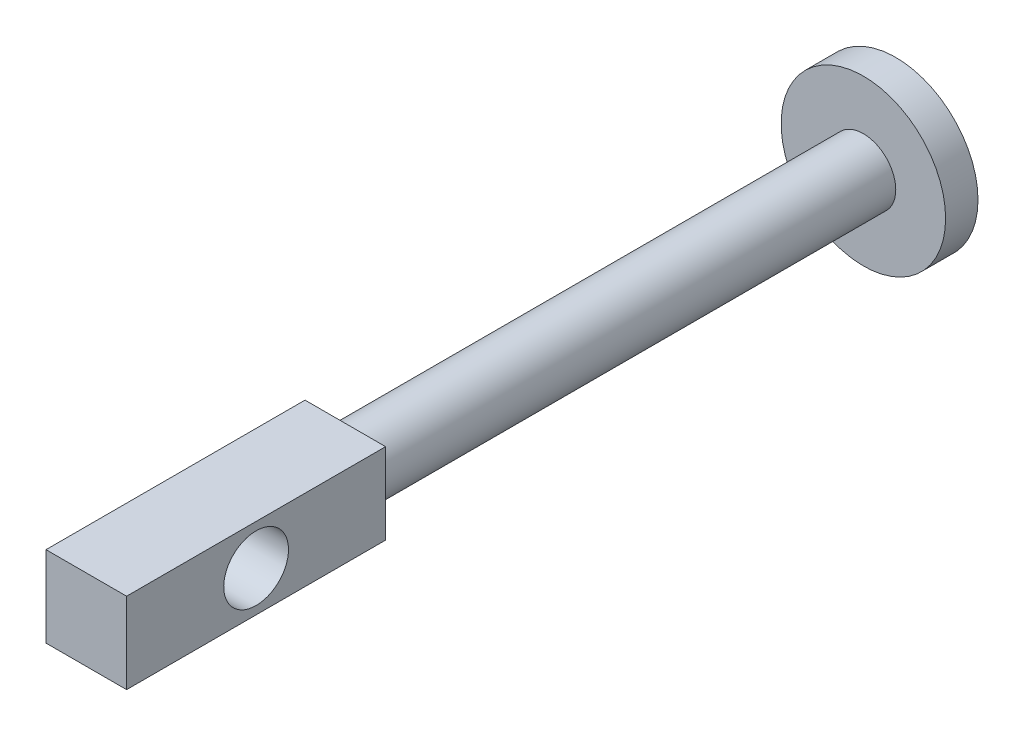
ISO-10303-21;
HEADER;
FILE_DESCRIPTION(('STEP AP214'),'2;1');
FILE_NAME('part.step','',(''),(''),'','','');
FILE_SCHEMA(('AUTOMOTIVE_DESIGN { 1 0 10303 214 1 1 1 1 }'));
ENDSEC;
DATA;
#1=APPLICATION_CONTEXT('core data for automotive mechanical design processes');
#2=APPLICATION_PROTOCOL_DEFINITION('international standard','automotive_design',2000,#1);
#3=PRODUCT_CONTEXT('',#1,'mechanical');
#4=PRODUCT('Part','Part','',(#3));
#5=PRODUCT_RELATED_PRODUCT_CATEGORY('part','',(#4));
#6=PRODUCT_DEFINITION_FORMATION('','',#4);
#7=PRODUCT_DEFINITION_CONTEXT('part definition',#1,'design');
#8=PRODUCT_DEFINITION('design','',#6,#7);
#9=PRODUCT_DEFINITION_SHAPE('','',#8);
#10=(LENGTH_UNIT() NAMED_UNIT(*) SI_UNIT(.MILLI.,.METRE.));
#11=(NAMED_UNIT(*) PLANE_ANGLE_UNIT() SI_UNIT($,.RADIAN.));
#12=(NAMED_UNIT(*) SI_UNIT($,.STERADIAN.) SOLID_ANGLE_UNIT());
#13=UNCERTAINTY_MEASURE_WITH_UNIT(LENGTH_MEASURE(1.E-05),#10,'distance_accuracy_value','');
#14=(GEOMETRIC_REPRESENTATION_CONTEXT(3) GLOBAL_UNCERTAINTY_ASSIGNED_CONTEXT((#13)) GLOBAL_UNIT_ASSIGNED_CONTEXT((#10,
#11,#12)) REPRESENTATION_CONTEXT('',''));
#15=CARTESIAN_POINT('',(0.,0.,0.));
#16=DIRECTION('',(0.,0.,1.));
#17=DIRECTION('',(1.,0.,0.));
#18=AXIS2_PLACEMENT_3D('',#15,#16,#17);
#19=CARTESIAN_POINT('',(0.,0.,5.));
#20=DIRECTION('',(0.,0.,1.));
#21=DIRECTION('',(1.,0.,0.));
#22=AXIS2_PLACEMENT_3D('',#19,#20,#21);
#23=PLANE('',#22);
#24=CARTESIAN_POINT('',(0.,0.,5.));
#25=DIRECTION('',(0.,0.,1.));
#26=DIRECTION('',(1.,0.,0.));
#27=AXIS2_PLACEMENT_3D('',#24,#25,#26);
#28=CIRCLE('',#27,12.7);
#29=CARTESIAN_POINT('',(12.7,0.,5.));
#30=VERTEX_POINT('',#29);
#31=EDGE_CURVE('E11',#30,#30,#28,.T.);
#32=ORIENTED_EDGE('',*,*,#31,.T.);
#33=EDGE_LOOP('',(#32));
#34=FACE_BOUND('',#33,.T.);
#35=CARTESIAN_POINT('',(0.,0.,5.));
#36=DIRECTION('',(0.,0.,1.));
#37=DIRECTION('',(1.,0.,0.));
#38=AXIS2_PLACEMENT_3D('',#35,#36,#37);
#39=CIRCLE('',#38,5.);
#40=CARTESIAN_POINT('',(5.,0.,5.));
#41=VERTEX_POINT('',#40);
#42=EDGE_CURVE('E130',#41,#41,#39,.T.);
#43=ORIENTED_EDGE('',*,*,#42,.F.);
#44=EDGE_LOOP('',(#43));
#45=FACE_BOUND('',#44,.T.);
#46=ADVANCED_FACE('F39',(#34,#45),#23,.T.);
#47=CARTESIAN_POINT('',(0.,0.,5.));
#48=DIRECTION('',(0.,0.,-1.));
#49=DIRECTION('',(-1.,0.,0.));
#50=AXIS2_PLACEMENT_3D('',#47,#48,#49);
#51=CYLINDRICAL_SURFACE('',#50,12.7);
#52=ORIENTED_EDGE('',*,*,#31,.F.);
#53=EDGE_LOOP('',(#52));
#54=FACE_BOUND('',#53,.T.);
#55=CARTESIAN_POINT('',(0.,0.,0.));
#56=DIRECTION('',(0.,0.,1.));
#57=DIRECTION('',(1.,0.,0.));
#58=AXIS2_PLACEMENT_3D('',#55,#56,#57);
#59=CIRCLE('',#58,12.7);
#60=CARTESIAN_POINT('',(12.7,0.,0.));
#61=VERTEX_POINT('',#60);
#62=EDGE_CURVE('E50',#61,#61,#59,.T.);
#63=ORIENTED_EDGE('',*,*,#62,.T.);
#64=EDGE_LOOP('',(#63));
#65=FACE_BOUND('',#64,.T.);
#66=ADVANCED_FACE('F41',(#54,#65),#51,.T.);
#67=CARTESIAN_POINT('',(0.,0.,0.));
#68=DIRECTION('',(0.,0.,1.));
#69=DIRECTION('',(1.,0.,0.));
#70=AXIS2_PLACEMENT_3D('',#67,#68,#69);
#71=PLANE('',#70);
#72=ORIENTED_EDGE('',*,*,#62,.F.);
#73=EDGE_LOOP('',(#72));
#74=FACE_BOUND('',#73,.T.);
#75=ADVANCED_FACE('F142',(#74),#71,.F.);
#76=CARTESIAN_POINT('',(0.,0.,85.));
#77=DIRECTION('',(0.,0.,-1.));
#78=DIRECTION('',(-1.,0.,0.));
#79=AXIS2_PLACEMENT_3D('',#76,#77,#78);
#80=CYLINDRICAL_SURFACE('',#79,5.);
#81=CARTESIAN_POINT('',(0.,0.,85.));
#82=DIRECTION('',(0.,0.,1.));
#83=DIRECTION('',(1.,0.,0.));
#84=AXIS2_PLACEMENT_3D('',#81,#82,#83);
#85=CIRCLE('',#84,5.);
#86=CARTESIAN_POINT('',(5.,0.,85.));
#87=VERTEX_POINT('',#86);
#88=EDGE_CURVE('E131',#87,#87,#85,.T.);
#89=ORIENTED_EDGE('',*,*,#88,.F.);
#90=EDGE_LOOP('',(#89));
#91=FACE_BOUND('',#90,.T.);
#92=ORIENTED_EDGE('',*,*,#42,.T.);
#93=EDGE_LOOP('',(#92));
#94=FACE_BOUND('',#93,.T.);
#95=ADVANCED_FACE('F144',(#91,#94),#80,.T.);
#96=CARTESIAN_POINT('',(-6.223,6.25,125.));
#97=DIRECTION('',(1.,0.,0.));
#98=DIRECTION('',(0.,1.,0.));
#99=AXIS2_PLACEMENT_3D('',#96,#97,#98);
#100=PLANE('',#99);
#101=CARTESIAN_POINT('',(-6.223,0.,105.));
#102=DIRECTION('',(-1.,0.,0.));
#103=DIRECTION('',(0.,-1.,0.));
#104=AXIS2_PLACEMENT_3D('',#101,#102,#103);
#105=CIRCLE('',#104,5.);
#106=CARTESIAN_POINT('',(-6.223,-5.00000000000001,105.));
#107=VERTEX_POINT('',#106);
#108=EDGE_CURVE('E185',#107,#107,#105,.T.);
#109=ORIENTED_EDGE('',*,*,#108,.F.);
#110=EDGE_LOOP('',(#109));
#111=FACE_BOUND('',#110,.T.);
#112=DIRECTION('',(0.,-1.,0.));
#113=VECTOR('',#112,1.);
#114=CARTESIAN_POINT('',(-6.223,6.25,85.));
#115=LINE('',#114,#113);
#116=CARTESIAN_POINT('',(-6.223,6.25,85.));
#117=VERTEX_POINT('',#116);
#118=CARTESIAN_POINT('',(-6.223,-6.25,85.));
#119=VERTEX_POINT('',#118);
#120=EDGE_CURVE('E114',#117,#119,#115,.T.);
#121=ORIENTED_EDGE('',*,*,#120,.T.);
#122=DIRECTION('',(0.,0.,-1.));
#123=VECTOR('',#122,1.);
#124=CARTESIAN_POINT('',(-6.223,-6.25,125.));
#125=LINE('',#124,#123);
#126=CARTESIAN_POINT('',(-6.223,-6.25,125.));
#127=VERTEX_POINT('',#126);
#128=EDGE_CURVE('E103',#127,#119,#125,.T.);
#129=ORIENTED_EDGE('',*,*,#128,.F.);
#130=DIRECTION('',(0.,-1.,0.));
#131=VECTOR('',#130,1.);
#132=CARTESIAN_POINT('',(-6.223,6.25,125.));
#133=LINE('',#132,#131);
#134=CARTESIAN_POINT('',(-6.223,6.25,125.));
#135=VERTEX_POINT('',#134);
#136=EDGE_CURVE('E95',#135,#127,#133,.T.);
#137=ORIENTED_EDGE('',*,*,#136,.F.);
#138=DIRECTION('',(0.,0.,-1.));
#139=VECTOR('',#138,1.);
#140=CARTESIAN_POINT('',(-6.223,6.25,125.));
#141=LINE('',#140,#139);
#142=EDGE_CURVE('E110',#135,#117,#141,.T.);
#143=ORIENTED_EDGE('',*,*,#142,.T.);
#144=EDGE_LOOP('',(#121,#129,#137,#143));
#145=FACE_BOUND('',#144,.T.);
#146=ADVANCED_FACE('F149',(#111,#145),#100,.F.);
#147=CARTESIAN_POINT('',(6.223,-6.25,125.));
#148=DIRECTION('',(0.,1.,0.));
#149=DIRECTION('',(-1.,0.,0.));
#150=AXIS2_PLACEMENT_3D('',#147,#148,#149);
#151=PLANE('',#150);
#152=DIRECTION('',(1.,0.,0.));
#153=VECTOR('',#152,1.);
#154=CARTESIAN_POINT('',(6.223,-6.25,85.));
#155=LINE('',#154,#153);
#156=CARTESIAN_POINT('',(6.223,-6.25,85.));
#157=VERTEX_POINT('',#156);
#158=EDGE_CURVE('E101',#119,#157,#155,.T.);
#159=ORIENTED_EDGE('',*,*,#158,.T.);
#160=DIRECTION('',(0.,0.,-1.));
#161=VECTOR('',#160,1.);
#162=CARTESIAN_POINT('',(6.223,-6.25,125.));
#163=LINE('',#162,#161);
#164=CARTESIAN_POINT('',(6.223,-6.25,125.));
#165=VERTEX_POINT('',#164);
#166=EDGE_CURVE('E99',#165,#157,#163,.T.);
#167=ORIENTED_EDGE('',*,*,#166,.F.);
#168=DIRECTION('',(1.,0.,0.));
#169=VECTOR('',#168,1.);
#170=CARTESIAN_POINT('',(6.223,-6.25,125.));
#171=LINE('',#170,#169);
#172=EDGE_CURVE('E90',#127,#165,#171,.T.);
#173=ORIENTED_EDGE('',*,*,#172,.F.);
#174=ORIENTED_EDGE('',*,*,#128,.T.);
#175=EDGE_LOOP('',(#159,#167,#173,#174));
#176=FACE_BOUND('',#175,.T.);
#177=ADVANCED_FACE('F100',(#176),#151,.F.);
#178=CARTESIAN_POINT('',(6.223,6.25,125.));
#179=DIRECTION('',(-1.,0.,0.));
#180=DIRECTION('',(0.,-1.,0.));
#181=AXIS2_PLACEMENT_3D('',#178,#179,#180);
#182=PLANE('',#181);
#183=CARTESIAN_POINT('',(6.223,0.,105.));
#184=DIRECTION('',(-1.,0.,0.));
#185=DIRECTION('',(0.,-1.,0.));
#186=AXIS2_PLACEMENT_3D('',#183,#184,#185);
#187=CIRCLE('',#186,5.);
#188=CARTESIAN_POINT('',(6.223,-5.,105.));
#189=VERTEX_POINT('',#188);
#190=EDGE_CURVE('E43',#189,#189,#187,.T.);
#191=ORIENTED_EDGE('',*,*,#190,.T.);
#192=EDGE_LOOP('',(#191));
#193=FACE_BOUND('',#192,.T.);
#194=DIRECTION('',(0.,1.,0.));
#195=VECTOR('',#194,1.);
#196=CARTESIAN_POINT('',(6.223,6.25,85.));
#197=LINE('',#196,#195);
#198=CARTESIAN_POINT('',(6.223,6.25,85.));
#199=VERTEX_POINT('',#198);
#200=EDGE_CURVE('E76',#157,#199,#197,.T.);
#201=ORIENTED_EDGE('',*,*,#200,.T.);
#202=DIRECTION('',(0.,0.,-1.));
#203=VECTOR('',#202,1.);
#204=CARTESIAN_POINT('',(6.223,6.25,125.));
#205=LINE('',#204,#203);
#206=CARTESIAN_POINT('',(6.223,6.25,125.));
#207=VERTEX_POINT('',#206);
#208=EDGE_CURVE('E104',#207,#199,#205,.T.);
#209=ORIENTED_EDGE('',*,*,#208,.F.);
#210=DIRECTION('',(0.,1.,0.));
#211=VECTOR('',#210,1.);
#212=CARTESIAN_POINT('',(6.223,6.25,125.));
#213=LINE('',#212,#211);
#214=EDGE_CURVE('E93',#165,#207,#213,.T.);
#215=ORIENTED_EDGE('',*,*,#214,.F.);
#216=ORIENTED_EDGE('',*,*,#166,.T.);
#217=EDGE_LOOP('',(#201,#209,#215,#216));
#218=FACE_BOUND('',#217,.T.);
#219=ADVANCED_FACE('F106',(#193,#218),#182,.F.);
#220=CARTESIAN_POINT('',(6.223,6.25,125.));
#221=DIRECTION('',(0.,-1.,0.));
#222=DIRECTION('',(1.,0.,0.));
#223=AXIS2_PLACEMENT_3D('',#220,#221,#222);
#224=PLANE('',#223);
#225=DIRECTION('',(-1.,0.,0.));
#226=VECTOR('',#225,1.);
#227=CARTESIAN_POINT('',(6.223,6.25,85.));
#228=LINE('',#227,#226);
#229=EDGE_CURVE('E82',#199,#117,#228,.T.);
#230=ORIENTED_EDGE('',*,*,#229,.T.);
#231=ORIENTED_EDGE('',*,*,#142,.F.);
#232=DIRECTION('',(-1.,0.,0.));
#233=VECTOR('',#232,1.);
#234=CARTESIAN_POINT('',(6.223,6.25,125.));
#235=LINE('',#234,#233);
#236=EDGE_CURVE('E59',#207,#135,#235,.T.);
#237=ORIENTED_EDGE('',*,*,#236,.F.);
#238=ORIENTED_EDGE('',*,*,#208,.T.);
#239=EDGE_LOOP('',(#230,#231,#237,#238));
#240=FACE_BOUND('',#239,.T.);
#241=ADVANCED_FACE('F167',(#240),#224,.F.);
#242=CARTESIAN_POINT('',(0.,0.,125.));
#243=DIRECTION('',(0.,0.,-1.));
#244=DIRECTION('',(-1.,0.,0.));
#245=AXIS2_PLACEMENT_3D('',#242,#243,#244);
#246=PLANE('',#245);
#247=ORIENTED_EDGE('',*,*,#136,.T.);
#248=ORIENTED_EDGE('',*,*,#172,.T.);
#249=ORIENTED_EDGE('',*,*,#214,.T.);
#250=ORIENTED_EDGE('',*,*,#236,.T.);
#251=EDGE_LOOP('',(#247,#248,#249,#250));
#252=FACE_BOUND('',#251,.T.);
#253=ADVANCED_FACE('F91',(#252),#246,.F.);
#254=CARTESIAN_POINT('',(0.,0.,85.));
#255=DIRECTION('',(0.,0.,-1.));
#256=DIRECTION('',(-1.,0.,0.));
#257=AXIS2_PLACEMENT_3D('',#254,#255,#256);
#258=PLANE('',#257);
#259=ORIENTED_EDGE('',*,*,#88,.T.);
#260=EDGE_LOOP('',(#259));
#261=FACE_BOUND('',#260,.T.);
#262=ORIENTED_EDGE('',*,*,#120,.F.);
#263=ORIENTED_EDGE('',*,*,#229,.F.);
#264=ORIENTED_EDGE('',*,*,#200,.F.);
#265=ORIENTED_EDGE('',*,*,#158,.F.);
#266=EDGE_LOOP('',(#262,#263,#264,#265));
#267=FACE_BOUND('',#266,.T.);
#268=ADVANCED_FACE('F171',(#261,#267),#258,.T.);
#269=CARTESIAN_POINT('',(12.7,0.,105.));
#270=DIRECTION('',(-1.,0.,0.));
#271=DIRECTION('',(0.,-1.,0.));
#272=AXIS2_PLACEMENT_3D('',#269,#270,#271);
#273=CYLINDRICAL_SURFACE('',#272,5.);
#274=ORIENTED_EDGE('',*,*,#108,.T.);
#275=EDGE_LOOP('',(#274));
#276=FACE_BOUND('',#275,.T.);
#277=ORIENTED_EDGE('',*,*,#190,.F.);
#278=EDGE_LOOP('',(#277));
#279=FACE_BOUND('',#278,.T.);
#280=ADVANCED_FACE('F174',(#276,#279),#273,.F.);
#281=CLOSED_SHELL('',(#46,#66,#75,#95,#146,#177,#219,#241,#253,#268,#280));
#282=MANIFOLD_SOLID_BREP('B2',#281);
#283=ADVANCED_BREP_SHAPE_REPRESENTATION('',(#18,#282),#14);
#284=SHAPE_DEFINITION_REPRESENTATION(#9,#283);
ENDSEC;
END-ISO-10303-21;
